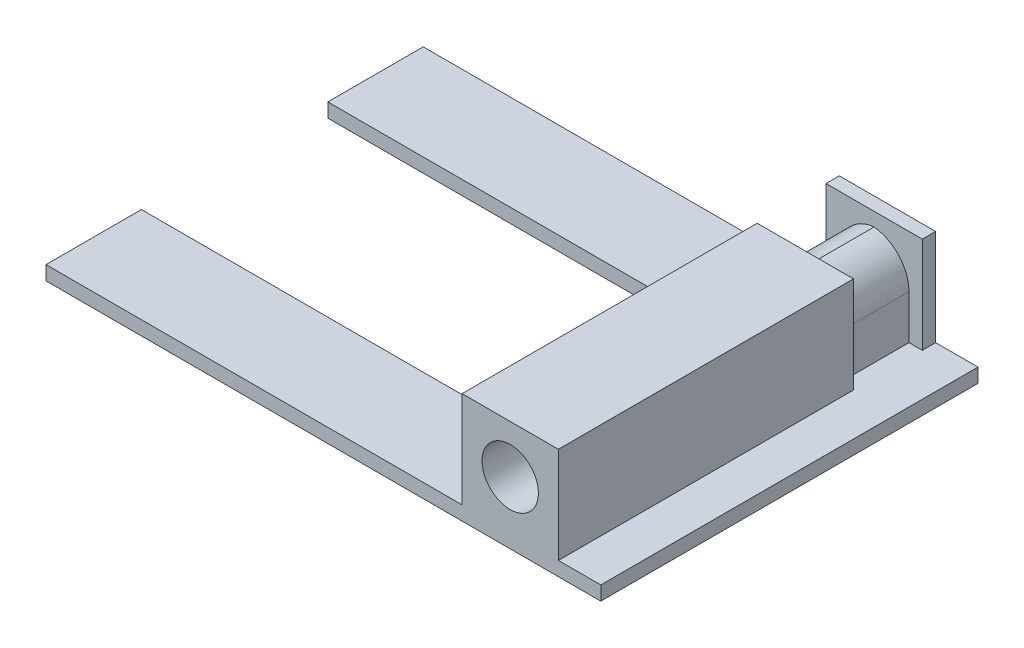
ISO-10303-21;
HEADER;
FILE_DESCRIPTION(('STEP AP214'),'2;1');
FILE_NAME('part.step','',(''),(''),'','','');
FILE_SCHEMA(('AUTOMOTIVE_DESIGN { 1 0 10303 214 1 1 1 1 }'));
ENDSEC;
DATA;
#1=APPLICATION_CONTEXT('core data for automotive mechanical design processes');
#2=APPLICATION_PROTOCOL_DEFINITION('international standard','automotive_design',2000,#1);
#3=PRODUCT_CONTEXT('',#1,'mechanical');
#4=PRODUCT('Part','Part','',(#3));
#5=PRODUCT_RELATED_PRODUCT_CATEGORY('part','',(#4));
#6=PRODUCT_DEFINITION_FORMATION('','',#4);
#7=PRODUCT_DEFINITION_CONTEXT('part definition',#1,'design');
#8=PRODUCT_DEFINITION('design','',#6,#7);
#9=PRODUCT_DEFINITION_SHAPE('','',#8);
#10=(LENGTH_UNIT() NAMED_UNIT(*) SI_UNIT(.MILLI.,.METRE.));
#11=(NAMED_UNIT(*) PLANE_ANGLE_UNIT() SI_UNIT($,.RADIAN.));
#12=(NAMED_UNIT(*) SI_UNIT($,.STERADIAN.) SOLID_ANGLE_UNIT());
#13=UNCERTAINTY_MEASURE_WITH_UNIT(LENGTH_MEASURE(1.E-05),#10,'distance_accuracy_value','');
#14=(GEOMETRIC_REPRESENTATION_CONTEXT(3) GLOBAL_UNCERTAINTY_ASSIGNED_CONTEXT((#13)) GLOBAL_UNIT_ASSIGNED_CONTEXT((#10,
#11,#12)) REPRESENTATION_CONTEXT('',''));
#15=CARTESIAN_POINT('',(0.,0.,0.));
#16=DIRECTION('',(0.,0.,1.));
#17=DIRECTION('',(1.,0.,0.));
#18=AXIS2_PLACEMENT_3D('',#15,#16,#17);
#19=CARTESIAN_POINT('',(94.2504259763748,12.7,-171.211944751792));
#20=DIRECTION('',(1.,0.,0.));
#21=DIRECTION('',(0.,0.,-1.));
#22=AXIS2_PLACEMENT_3D('',#19,#20,#21);
#23=PLANE('',#22);
#24=DIRECTION('',(0.,1.,0.));
#25=VECTOR('',#24,1.);
#26=CARTESIAN_POINT('',(94.2504259763747,87.5000000000001,-159.211944751791));
#27=LINE('',#26,#25);
#28=CARTESIAN_POINT('',(94.2504259763748,12.7,-159.211944751791));
#29=VERTEX_POINT('',#28);
#30=CARTESIAN_POINT('',(94.2504259763747,99.5000000000001,-159.211944751791));
#31=VERTEX_POINT('',#30);
#32=EDGE_CURVE('E238',#29,#31,#27,.T.);
#33=ORIENTED_EDGE('',*,*,#32,.F.);
#34=DIRECTION('',(0.,0.,1.));
#35=VECTOR('',#34,1.);
#36=CARTESIAN_POINT('',(94.2504259763748,12.7,-171.211944751792));
#37=LINE('',#36,#35);
#38=CARTESIAN_POINT('',(94.2504259763748,12.7,-171.211944751792));
#39=VERTEX_POINT('',#38);
#40=EDGE_CURVE('E293',#39,#29,#37,.T.);
#41=ORIENTED_EDGE('',*,*,#40,.F.);
#42=DIRECTION('',(0.,1.,0.));
#43=VECTOR('',#42,1.);
#44=CARTESIAN_POINT('',(94.2504259763748,12.7,-171.211944751792));
#45=LINE('',#44,#43);
#46=CARTESIAN_POINT('',(94.2504259763748,99.5000000000002,-171.211944751792));
#47=VERTEX_POINT('',#46);
#48=EDGE_CURVE('E262',#39,#47,#45,.T.);
#49=ORIENTED_EDGE('',*,*,#48,.T.);
#50=DIRECTION('',(0.,0.,1.));
#51=VECTOR('',#50,1.);
#52=CARTESIAN_POINT('',(94.2504259763748,99.5000000000002,-171.211944751792));
#53=LINE('',#52,#51);
#54=EDGE_CURVE('E288',#47,#31,#53,.T.);
#55=ORIENTED_EDGE('',*,*,#54,.T.);
#56=EDGE_LOOP('',(#33,#41,#49,#55));
#57=FACE_BOUND('',#56,.T.);
#58=ADVANCED_FACE('F39',(#57),#23,.T.);
#59=CARTESIAN_POINT('',(7.45042597637463,12.7,-85.2119447517915));
#60=DIRECTION('',(1.,0.,0.));
#61=DIRECTION('',(0.,0.,-1.));
#62=AXIS2_PLACEMENT_3D('',#59,#60,#61);
#63=PLANE('',#62);
#64=DIRECTION('',(0.,1.,0.));
#65=VECTOR('',#64,1.);
#66=CARTESIAN_POINT('',(7.45042597637467,87.5000000000001,-97.2119447517915));
#67=LINE('',#66,#65);
#68=CARTESIAN_POINT('',(7.45042597637463,12.7,-97.2119447517915));
#69=VERTEX_POINT('',#68);
#70=CARTESIAN_POINT('',(7.45042597637467,99.5000000000001,-97.2119447517915));
#71=VERTEX_POINT('',#70);
#72=EDGE_CURVE('E242',#69,#71,#67,.T.);
#73=ORIENTED_EDGE('',*,*,#72,.F.);
#74=DIRECTION('',(0.,0.,1.));
#75=VECTOR('',#74,1.);
#76=CARTESIAN_POINT('',(7.45042597637468,12.7,-171.211944751792));
#77=LINE('',#76,#75);
#78=CARTESIAN_POINT('',(7.45042597637468,12.7,-85.2119447517915));
#79=VERTEX_POINT('',#78);
#80=EDGE_CURVE('E271',#69,#79,#77,.T.);
#81=ORIENTED_EDGE('',*,*,#80,.T.);
#82=DIRECTION('',(0.,-1.,0.));
#83=VECTOR('',#82,1.);
#84=CARTESIAN_POINT('',(7.45042597637463,12.7,-85.2119447517915));
#85=LINE('',#84,#83);
#86=CARTESIAN_POINT('',(7.45042597637463,0.,-85.2119447517915));
#87=VERTEX_POINT('',#86);
#88=EDGE_CURVE('E331',#79,#87,#85,.T.);
#89=ORIENTED_EDGE('',*,*,#88,.T.);
#90=DIRECTION('',(0.,0.,1.));
#91=VECTOR('',#90,1.);
#92=CARTESIAN_POINT('',(7.45042597637463,0.,-85.2119447517915));
#93=LINE('',#92,#91);
#94=CARTESIAN_POINT('',(7.45042597637466,0.,82.7880552482085));
#95=VERTEX_POINT('',#94);
#96=EDGE_CURVE('E286',#87,#95,#93,.T.);
#97=ORIENTED_EDGE('',*,*,#96,.T.);
#98=DIRECTION('',(0.,-1.,0.));
#99=VECTOR('',#98,1.);
#100=CARTESIAN_POINT('',(7.45042597637466,12.7,82.7880552482085));
#101=LINE('',#100,#99);
#102=CARTESIAN_POINT('',(7.45042597637468,12.7,82.7880552482085));
#103=VERTEX_POINT('',#102);
#104=EDGE_CURVE('E382',#103,#95,#101,.T.);
#105=ORIENTED_EDGE('',*,*,#104,.F.);
#106=CARTESIAN_POINT('',(7.45042597637468,12.7,168.788055248209));
#107=VERTEX_POINT('',#106);
#108=EDGE_CURVE('E301',#103,#107,#77,.T.);
#109=ORIENTED_EDGE('',*,*,#108,.T.);
#110=DIRECTION('',(0.,-1.,0.));
#111=VECTOR('',#110,1.);
#112=CARTESIAN_POINT('',(7.45042597637468,12.7,168.788055248209));
#113=LINE('',#112,#111);
#114=CARTESIAN_POINT('',(7.45042597637468,99.5000000000001,168.788055248209));
#115=VERTEX_POINT('',#114);
#116=EDGE_CURVE('E255',#115,#107,#113,.T.);
#117=ORIENTED_EDGE('',*,*,#116,.F.);
#118=DIRECTION('',(0.,0.,1.));
#119=VECTOR('',#118,1.);
#120=CARTESIAN_POINT('',(7.45042597637468,99.5000000000001,-171.211944751792));
#121=LINE('',#120,#119);
#122=EDGE_CURVE('E287',#71,#115,#121,.T.);
#123=ORIENTED_EDGE('',*,*,#122,.F.);
#124=EDGE_LOOP('',(#73,#81,#89,#97,#105,#109,#117,#123));
#125=FACE_BOUND('',#124,.T.);
#126=ADVANCED_FACE('F407',(#125),#63,.F.);
#127=CARTESIAN_POINT('',(7.45042597637468,99.5000000000001,-171.211944751792));
#128=DIRECTION('',(0.,1.,0.));
#129=DIRECTION('',(-1.,0.,0.));
#130=AXIS2_PLACEMENT_3D('',#127,#128,#129);
#131=PLANE('',#130);
#132=DIRECTION('',(1.,0.,0.));
#133=VECTOR('',#132,1.);
#134=CARTESIAN_POINT('',(7.45042597637467,99.5000000000001,-97.2119447517915));
#135=LINE('',#134,#133);
#136=CARTESIAN_POINT('',(94.2504259763747,99.5000000000001,-97.2119447517915));
#137=VERTEX_POINT('',#136);
#138=EDGE_CURVE('E235',#71,#137,#135,.T.);
#139=ORIENTED_EDGE('',*,*,#138,.F.);
#140=ORIENTED_EDGE('',*,*,#122,.T.);
#141=DIRECTION('',(-1.,0.,0.));
#142=VECTOR('',#141,1.);
#143=CARTESIAN_POINT('',(7.45042597637468,99.5000000000001,168.788055248209));
#144=LINE('',#143,#142);
#145=CARTESIAN_POINT('',(94.2504259763748,99.5000000000002,168.788055248209));
#146=VERTEX_POINT('',#145);
#147=EDGE_CURVE('E263',#146,#115,#144,.T.);
#148=ORIENTED_EDGE('',*,*,#147,.F.);
#149=EDGE_CURVE('E292',#137,#146,#53,.T.);
#150=ORIENTED_EDGE('',*,*,#149,.F.);
#151=EDGE_LOOP('',(#139,#140,#148,#150));
#152=FACE_BOUND('',#151,.T.);
#153=ADVANCED_FACE('F445',(#152),#131,.T.);
#154=CARTESIAN_POINT('',(0.,12.7,0.));
#155=DIRECTION('',(0.,-1.,0.));
#156=DIRECTION('',(0.,0.,-1.));
#157=AXIS2_PLACEMENT_3D('',#154,#155,#156);
#158=PLANE('',#157);
#159=CARTESIAN_POINT('',(7.45042597637468,12.7,-171.211944751792));
#160=VERTEX_POINT('',#159);
#161=CARTESIAN_POINT('',(7.45042597637462,12.7,-159.211944751791));
#162=VERTEX_POINT('',#161);
#163=EDGE_CURVE('E297',#160,#162,#77,.T.);
#164=ORIENTED_EDGE('',*,*,#163,.F.);
#165=DIRECTION('',(1.,0.,0.));
#166=VECTOR('',#165,1.);
#167=CARTESIAN_POINT('',(-367.549574023625,12.7,-171.211944751791));
#168=LINE('',#167,#166);
#169=CARTESIAN_POINT('',(-367.549574023625,12.7,-171.211944751791));
#170=VERTEX_POINT('',#169);
#171=EDGE_CURVE('E320',#170,#160,#168,.T.);
#172=ORIENTED_EDGE('',*,*,#171,.F.);
#173=DIRECTION('',(0.,0.,1.));
#174=VECTOR('',#173,1.);
#175=CARTESIAN_POINT('',(-367.549574023625,12.7,-171.211944751791));
#176=LINE('',#175,#174);
#177=CARTESIAN_POINT('',(-367.549574023625,12.7,-85.2119447517915));
#178=VERTEX_POINT('',#177);
#179=EDGE_CURVE('E324',#170,#178,#176,.T.);
#180=ORIENTED_EDGE('',*,*,#179,.T.);
#181=DIRECTION('',(1.,0.,0.));
#182=VECTOR('',#181,1.);
#183=CARTESIAN_POINT('',(-367.549574023625,12.7,-85.2119447517915));
#184=LINE('',#183,#182);
#185=EDGE_CURVE('E327',#178,#79,#184,.T.);
#186=ORIENTED_EDGE('',*,*,#185,.T.);
#187=ORIENTED_EDGE('',*,*,#80,.F.);
#188=DIRECTION('',(-1.,0.,0.));
#189=VECTOR('',#188,1.);
#190=CARTESIAN_POINT('',(19.4504259763746,12.7,-97.2119447517915));
#191=LINE('',#190,#189);
#192=CARTESIAN_POINT('',(19.4504259763746,12.7,-97.2119447517915));
#193=VERTEX_POINT('',#192);
#194=EDGE_CURVE('E228',#193,#69,#191,.T.);
#195=ORIENTED_EDGE('',*,*,#194,.F.);
#196=DIRECTION('',(0.,0.,1.));
#197=VECTOR('',#196,1.);
#198=CARTESIAN_POINT('',(19.4504259763746,12.7,-159.211944751791));
#199=LINE('',#198,#197);
#200=CARTESIAN_POINT('',(19.4504259763746,12.7,-159.211944751791));
#201=VERTEX_POINT('',#200);
#202=EDGE_CURVE('E217',#201,#193,#199,.T.);
#203=ORIENTED_EDGE('',*,*,#202,.F.);
#204=DIRECTION('',(-1.,0.,0.));
#205=VECTOR('',#204,1.);
#206=CARTESIAN_POINT('',(19.4504259763746,12.7,-159.211944751791));
#207=LINE('',#206,#205);
#208=EDGE_CURVE('E224',#201,#162,#207,.T.);
#209=ORIENTED_EDGE('',*,*,#208,.T.);
#210=EDGE_LOOP('',(#164,#172,#180,#186,#187,#195,#203,#209));
#211=FACE_BOUND('',#210,.T.);
#212=ADVANCED_FACE('F415',(#211),#158,.F.);
#213=ORIENTED_EDGE('',*,*,#108,.F.);
#214=DIRECTION('',(-1.,0.,0.));
#215=VECTOR('',#214,1.);
#216=CARTESIAN_POINT('',(7.45042597637466,12.7,82.7880552482085));
#217=LINE('',#216,#215);
#218=CARTESIAN_POINT('',(-367.549574023625,12.7,82.7880552482085));
#219=VERTEX_POINT('',#218);
#220=EDGE_CURVE('E302',#103,#219,#217,.T.);
#221=ORIENTED_EDGE('',*,*,#220,.T.);
#222=DIRECTION('',(0.,0.,1.));
#223=VECTOR('',#222,1.);
#224=CARTESIAN_POINT('',(-367.549574023625,12.7,82.7880552482085));
#225=LINE('',#224,#223);
#226=CARTESIAN_POINT('',(-367.549574023625,12.7,168.788055248208));
#227=VERTEX_POINT('',#226);
#228=EDGE_CURVE('E305',#219,#227,#225,.T.);
#229=ORIENTED_EDGE('',*,*,#228,.T.);
#230=DIRECTION('',(-1.,0.,0.));
#231=VECTOR('',#230,1.);
#232=CARTESIAN_POINT('',(132.450425976375,12.7,168.788055248209));
#233=LINE('',#232,#231);
#234=EDGE_CURVE('E310',#107,#227,#233,.T.);
#235=ORIENTED_EDGE('',*,*,#234,.F.);
#236=EDGE_LOOP('',(#213,#221,#229,#235));
#237=FACE_BOUND('',#236,.T.);
#238=ADVANCED_FACE('F435',(#237),#158,.F.);
#239=ORIENTED_EDGE('',*,*,#163,.T.);
#240=DIRECTION('',(0.,1.,0.));
#241=VECTOR('',#240,1.);
#242=CARTESIAN_POINT('',(7.45042597637467,87.5000000000001,-159.211944751791));
#243=LINE('',#242,#241);
#244=CARTESIAN_POINT('',(7.45042597637467,99.5000000000001,-159.211944751791));
#245=VERTEX_POINT('',#244);
#246=EDGE_CURVE('E245',#162,#245,#243,.T.);
#247=ORIENTED_EDGE('',*,*,#246,.T.);
#248=CARTESIAN_POINT('',(7.45042597637468,99.5000000000001,-171.211944751792));
#249=VERTEX_POINT('',#248);
#250=EDGE_CURVE('E282',#249,#245,#121,.T.);
#251=ORIENTED_EDGE('',*,*,#250,.F.);
#252=DIRECTION('',(0.,-1.,0.));
#253=VECTOR('',#252,1.);
#254=CARTESIAN_POINT('',(7.45042597637468,12.7,-171.211944751792));
#255=LINE('',#254,#253);
#256=EDGE_CURVE('E259',#249,#160,#255,.T.);
#257=ORIENTED_EDGE('',*,*,#256,.T.);
#258=EDGE_LOOP('',(#239,#247,#251,#257));
#259=FACE_BOUND('',#258,.T.);
#260=ADVANCED_FACE('F485',(#259),#63,.F.);
#261=CARTESIAN_POINT('',(7.45042597637466,12.7,82.7880552482085));
#262=DIRECTION('',(0.,0.,1.));
#263=DIRECTION('',(1.,0.,0.));
#264=AXIS2_PLACEMENT_3D('',#261,#262,#263);
#265=PLANE('',#264);
#266=DIRECTION('',(-1.,0.,0.));
#267=VECTOR('',#266,1.);
#268=CARTESIAN_POINT('',(7.45042597637466,0.,82.7880552482085));
#269=LINE('',#268,#267);
#270=CARTESIAN_POINT('',(-367.549574023625,0.,82.7880552482085));
#271=VERTEX_POINT('',#270);
#272=EDGE_CURVE('E335',#95,#271,#269,.T.);
#273=ORIENTED_EDGE('',*,*,#272,.T.);
#274=DIRECTION('',(0.,-1.,0.));
#275=VECTOR('',#274,1.);
#276=CARTESIAN_POINT('',(-367.549574023625,12.7,82.7880552482085));
#277=LINE('',#276,#275);
#278=EDGE_CURVE('E378',#219,#271,#277,.T.);
#279=ORIENTED_EDGE('',*,*,#278,.F.);
#280=ORIENTED_EDGE('',*,*,#220,.F.);
#281=ORIENTED_EDGE('',*,*,#104,.T.);
#282=EDGE_LOOP('',(#273,#279,#280,#281));
#283=FACE_BOUND('',#282,.T.);
#284=ADVANCED_FACE('F431',(#283),#265,.F.);
#285=CARTESIAN_POINT('',(-367.549574023625,12.7,82.7880552482085));
#286=DIRECTION('',(1.,0.,0.));
#287=DIRECTION('',(0.,0.,-1.));
#288=AXIS2_PLACEMENT_3D('',#285,#286,#287);
#289=PLANE('',#288);
#290=DIRECTION('',(0.,0.,1.));
#291=VECTOR('',#290,1.);
#292=CARTESIAN_POINT('',(-367.549574023625,0.,82.7880552482085));
#293=LINE('',#292,#291);
#294=CARTESIAN_POINT('',(-367.549574023625,0.,168.788055248208));
#295=VERTEX_POINT('',#294);
#296=EDGE_CURVE('E338',#271,#295,#293,.T.);
#297=ORIENTED_EDGE('',*,*,#296,.T.);
#298=DIRECTION('',(0.,-1.,0.));
#299=VECTOR('',#298,1.);
#300=CARTESIAN_POINT('',(-367.549574023625,12.7,168.788055248208));
#301=LINE('',#300,#299);
#302=EDGE_CURVE('E375',#227,#295,#301,.T.);
#303=ORIENTED_EDGE('',*,*,#302,.F.);
#304=ORIENTED_EDGE('',*,*,#228,.F.);
#305=ORIENTED_EDGE('',*,*,#278,.T.);
#306=EDGE_LOOP('',(#297,#303,#304,#305));
#307=FACE_BOUND('',#306,.T.);
#308=ADVANCED_FACE('F527',(#307),#289,.F.);
#309=CARTESIAN_POINT('',(132.450425976375,12.7,168.788055248209));
#310=DIRECTION('',(0.,0.,1.));
#311=DIRECTION('',(1.,0.,0.));
#312=AXIS2_PLACEMENT_3D('',#309,#310,#311);
#313=PLANE('',#312);
#314=DIRECTION('',(-1.,0.,0.));
#315=VECTOR('',#314,1.);
#316=CARTESIAN_POINT('',(132.450425976375,0.,168.788055248209));
#317=LINE('',#316,#315);
#318=CARTESIAN_POINT('',(132.450425976375,0.,168.788055248209));
#319=VERTEX_POINT('',#318);
#320=EDGE_CURVE('E342',#319,#295,#317,.T.);
#321=ORIENTED_EDGE('',*,*,#320,.F.);
#322=DIRECTION('',(0.,-1.,0.));
#323=VECTOR('',#322,1.);
#324=CARTESIAN_POINT('',(132.450425976375,12.7,168.788055248209));
#325=LINE('',#324,#323);
#326=CARTESIAN_POINT('',(132.450425976375,12.7,168.788055248209));
#327=VERTEX_POINT('',#326);
#328=EDGE_CURVE('E372',#327,#319,#325,.T.);
#329=ORIENTED_EDGE('',*,*,#328,.F.);
#330=CARTESIAN_POINT('',(94.2504259763748,12.7,168.788055248209));
#331=VERTEX_POINT('',#330);
#332=EDGE_CURVE('E311',#327,#331,#233,.T.);
#333=ORIENTED_EDGE('',*,*,#332,.T.);
#334=DIRECTION('',(0.,1.,0.));
#335=VECTOR('',#334,1.);
#336=CARTESIAN_POINT('',(94.2504259763748,12.7,168.788055248209));
#337=LINE('',#336,#335);
#338=EDGE_CURVE('E275',#331,#146,#337,.T.);
#339=ORIENTED_EDGE('',*,*,#338,.T.);
#340=ORIENTED_EDGE('',*,*,#147,.T.);
#341=ORIENTED_EDGE('',*,*,#116,.T.);
#342=ORIENTED_EDGE('',*,*,#234,.T.);
#343=ORIENTED_EDGE('',*,*,#302,.T.);
#344=EDGE_LOOP('',(#321,#329,#333,#339,#340,#341,#342,#343));
#345=FACE_BOUND('',#344,.T.);
#346=CARTESIAN_POINT('',(50.8504259763747,56.1000000000001,168.788055248209));
#347=DIRECTION('',(0.,0.,1.));
#348=DIRECTION('',(1.,0.,0.));
#349=AXIS2_PLACEMENT_3D('',#346,#347,#348);
#350=CIRCLE('',#349,25.4);
#351=CARTESIAN_POINT('',(76.2504259763747,56.1000000000001,168.788055248209));
#352=VERTEX_POINT('',#351);
#353=EDGE_CURVE('E241',#352,#352,#350,.T.);
#354=ORIENTED_EDGE('',*,*,#353,.F.);
#355=EDGE_LOOP('',(#354));
#356=FACE_BOUND('',#355,.T.);
#357=ADVANCED_FACE('F440',(#345,#356),#313,.T.);
#358=CARTESIAN_POINT('',(132.450425976375,12.7,-171.211944751792));
#359=DIRECTION('',(1.,0.,0.));
#360=DIRECTION('',(0.,0.,-1.));
#361=AXIS2_PLACEMENT_3D('',#358,#359,#360);
#362=PLANE('',#361);
#363=DIRECTION('',(0.,0.,1.));
#364=VECTOR('',#363,1.);
#365=CARTESIAN_POINT('',(132.450425976375,0.,-171.211944751792));
#366=LINE('',#365,#364);
#367=CARTESIAN_POINT('',(132.450425976375,0.,-171.211944751792));
#368=VERTEX_POINT('',#367);
#369=EDGE_CURVE('E346',#368,#319,#366,.T.);
#370=ORIENTED_EDGE('',*,*,#369,.F.);
#371=DIRECTION('',(0.,-1.,0.));
#372=VECTOR('',#371,1.);
#373=CARTESIAN_POINT('',(132.450425976375,12.7,-171.211944751792));
#374=LINE('',#373,#372);
#375=CARTESIAN_POINT('',(132.450425976375,12.7,-171.211944751792));
#376=VERTEX_POINT('',#375);
#377=EDGE_CURVE('E369',#376,#368,#374,.T.);
#378=ORIENTED_EDGE('',*,*,#377,.F.);
#379=DIRECTION('',(0.,0.,1.));
#380=VECTOR('',#379,1.);
#381=CARTESIAN_POINT('',(132.450425976375,12.7,-171.211944751792));
#382=LINE('',#381,#380);
#383=EDGE_CURVE('E315',#376,#327,#382,.T.);
#384=ORIENTED_EDGE('',*,*,#383,.T.);
#385=ORIENTED_EDGE('',*,*,#328,.T.);
#386=EDGE_LOOP('',(#370,#378,#384,#385));
#387=FACE_BOUND('',#386,.T.);
#388=ADVANCED_FACE('F455',(#387),#362,.T.);
#389=CARTESIAN_POINT('',(-367.549574023625,12.7,-171.211944751791));
#390=DIRECTION('',(0.,0.,-1.));
#391=DIRECTION('',(-1.,0.,0.));
#392=AXIS2_PLACEMENT_3D('',#389,#390,#391);
#393=PLANE('',#392);
#394=DIRECTION('',(1.,0.,0.));
#395=VECTOR('',#394,1.);
#396=CARTESIAN_POINT('',(-367.549574023625,0.,-171.211944751791));
#397=LINE('',#396,#395);
#398=CARTESIAN_POINT('',(-367.549574023625,0.,-171.211944751791));
#399=VERTEX_POINT('',#398);
#400=EDGE_CURVE('E350',#399,#368,#397,.T.);
#401=ORIENTED_EDGE('',*,*,#400,.F.);
#402=DIRECTION('',(0.,-1.,0.));
#403=VECTOR('',#402,1.);
#404=CARTESIAN_POINT('',(-367.549574023625,12.7,-171.211944751791));
#405=LINE('',#404,#403);
#406=EDGE_CURVE('E366',#170,#399,#405,.T.);
#407=ORIENTED_EDGE('',*,*,#406,.F.);
#408=ORIENTED_EDGE('',*,*,#171,.T.);
#409=ORIENTED_EDGE('',*,*,#256,.F.);
#410=DIRECTION('',(-1.,0.,0.));
#411=VECTOR('',#410,1.);
#412=CARTESIAN_POINT('',(7.45042597637468,99.5000000000001,-171.211944751792));
#413=LINE('',#412,#411);
#414=EDGE_CURVE('E267',#47,#249,#413,.T.);
#415=ORIENTED_EDGE('',*,*,#414,.F.);
#416=ORIENTED_EDGE('',*,*,#48,.F.);
#417=EDGE_CURVE('E319',#39,#376,#168,.T.);
#418=ORIENTED_EDGE('',*,*,#417,.T.);
#419=ORIENTED_EDGE('',*,*,#377,.T.);
#420=EDGE_LOOP('',(#401,#407,#408,#409,#415,#416,#418,#419));
#421=FACE_BOUND('',#420,.T.);
#422=CARTESIAN_POINT('',(50.8504259763747,56.1000000000001,-171.211944751792));
#423=DIRECTION('',(0.,0.,1.));
#424=DIRECTION('',(1.,0.,0.));
#425=AXIS2_PLACEMENT_3D('',#422,#423,#424);
#426=CIRCLE('',#425,25.4);
#427=CARTESIAN_POINT('',(76.2504259763747,56.1000000000001,-171.211944751792));
#428=VERTEX_POINT('',#427);
#429=EDGE_CURVE('E251',#428,#428,#426,.T.);
#430=ORIENTED_EDGE('',*,*,#429,.T.);
#431=EDGE_LOOP('',(#430));
#432=FACE_BOUND('',#431,.T.);
#433=ADVANCED_FACE('F457',(#421,#432),#393,.T.);
#434=CARTESIAN_POINT('',(-367.549574023625,12.7,-171.211944751791));
#435=DIRECTION('',(1.,0.,0.));
#436=DIRECTION('',(0.,0.,-1.));
#437=AXIS2_PLACEMENT_3D('',#434,#435,#436);
#438=PLANE('',#437);
#439=DIRECTION('',(0.,0.,1.));
#440=VECTOR('',#439,1.);
#441=CARTESIAN_POINT('',(-367.549574023625,0.,-171.211944751791));
#442=LINE('',#441,#440);
#443=CARTESIAN_POINT('',(-367.549574023625,0.,-85.2119447517915));
#444=VERTEX_POINT('',#443);
#445=EDGE_CURVE('E354',#399,#444,#442,.T.);
#446=ORIENTED_EDGE('',*,*,#445,.T.);
#447=DIRECTION('',(0.,-1.,0.));
#448=VECTOR('',#447,1.);
#449=CARTESIAN_POINT('',(-367.549574023625,12.7,-85.2119447517915));
#450=LINE('',#449,#448);
#451=EDGE_CURVE('E362',#178,#444,#450,.T.);
#452=ORIENTED_EDGE('',*,*,#451,.F.);
#453=ORIENTED_EDGE('',*,*,#179,.F.);
#454=ORIENTED_EDGE('',*,*,#406,.T.);
#455=EDGE_LOOP('',(#446,#452,#453,#454));
#456=FACE_BOUND('',#455,.T.);
#457=ADVANCED_FACE('F513',(#456),#438,.F.);
#458=CARTESIAN_POINT('',(-367.549574023625,12.7,-85.2119447517915));
#459=DIRECTION('',(0.,0.,-1.));
#460=DIRECTION('',(-1.,0.,0.));
#461=AXIS2_PLACEMENT_3D('',#458,#459,#460);
#462=PLANE('',#461);
#463=DIRECTION('',(1.,0.,0.));
#464=VECTOR('',#463,1.);
#465=CARTESIAN_POINT('',(-367.549574023625,0.,-85.2119447517915));
#466=LINE('',#465,#464);
#467=EDGE_CURVE('E306',#444,#87,#466,.T.);
#468=ORIENTED_EDGE('',*,*,#467,.T.);
#469=ORIENTED_EDGE('',*,*,#88,.F.);
#470=ORIENTED_EDGE('',*,*,#185,.F.);
#471=ORIENTED_EDGE('',*,*,#451,.T.);
#472=EDGE_LOOP('',(#468,#469,#470,#471));
#473=FACE_BOUND('',#472,.T.);
#474=ADVANCED_FACE('F420',(#473),#462,.F.);
#475=ORIENTED_EDGE('',*,*,#417,.F.);
#476=ORIENTED_EDGE('',*,*,#40,.T.);
#477=DIRECTION('',(1.,0.,0.));
#478=VECTOR('',#477,1.);
#479=CARTESIAN_POINT('',(82.2504259763748,12.7,-159.211944751791));
#480=LINE('',#479,#478);
#481=CARTESIAN_POINT('',(82.2504259763748,12.7,-159.211944751791));
#482=VERTEX_POINT('',#481);
#483=EDGE_CURVE('E201',#482,#29,#480,.T.);
#484=ORIENTED_EDGE('',*,*,#483,.F.);
#485=DIRECTION('',(0.,0.,-1.));
#486=VECTOR('',#485,1.);
#487=CARTESIAN_POINT('',(82.2504259763748,12.7,-97.2119447517915));
#488=LINE('',#487,#486);
#489=CARTESIAN_POINT('',(82.2504259763748,12.7,-97.2119447517915));
#490=VERTEX_POINT('',#489);
#491=EDGE_CURVE('E187',#490,#482,#488,.T.);
#492=ORIENTED_EDGE('',*,*,#491,.F.);
#493=DIRECTION('',(1.,0.,0.));
#494=VECTOR('',#493,1.);
#495=CARTESIAN_POINT('',(82.2504259763748,12.7,-97.2119447517915));
#496=LINE('',#495,#494);
#497=CARTESIAN_POINT('',(94.2504259763748,12.7,-97.2119447517915));
#498=VERTEX_POINT('',#497);
#499=EDGE_CURVE('E194',#490,#498,#496,.T.);
#500=ORIENTED_EDGE('',*,*,#499,.T.);
#501=EDGE_CURVE('E296',#498,#331,#37,.T.);
#502=ORIENTED_EDGE('',*,*,#501,.T.);
#503=ORIENTED_EDGE('',*,*,#332,.F.);
#504=ORIENTED_EDGE('',*,*,#383,.F.);
#505=EDGE_LOOP('',(#475,#476,#484,#492,#500,#502,#503,#504));
#506=FACE_BOUND('',#505,.T.);
#507=ADVANCED_FACE('F204',(#506),#158,.F.);
#508=CARTESIAN_POINT('',(0.,0.,0.));
#509=DIRECTION('',(0.,-1.,0.));
#510=DIRECTION('',(0.,0.,-1.));
#511=AXIS2_PLACEMENT_3D('',#508,#509,#510);
#512=PLANE('',#511);
#513=ORIENTED_EDGE('',*,*,#96,.F.);
#514=ORIENTED_EDGE('',*,*,#467,.F.);
#515=ORIENTED_EDGE('',*,*,#445,.F.);
#516=ORIENTED_EDGE('',*,*,#400,.T.);
#517=ORIENTED_EDGE('',*,*,#369,.T.);
#518=ORIENTED_EDGE('',*,*,#320,.T.);
#519=ORIENTED_EDGE('',*,*,#296,.F.);
#520=ORIENTED_EDGE('',*,*,#272,.F.);
#521=EDGE_LOOP('',(#513,#514,#515,#516,#517,#518,#519,#520));
#522=FACE_BOUND('',#521,.T.);
#523=ADVANCED_FACE('F424',(#522),#512,.T.);
#524=DIRECTION('',(-1.,0.,0.));
#525=VECTOR('',#524,1.);
#526=CARTESIAN_POINT('',(7.45042597637467,99.5000000000001,-159.211944751791));
#527=LINE('',#526,#525);
#528=EDGE_CURVE('E232',#31,#245,#527,.T.);
#529=ORIENTED_EDGE('',*,*,#528,.F.);
#530=ORIENTED_EDGE('',*,*,#54,.F.);
#531=ORIENTED_EDGE('',*,*,#414,.T.);
#532=ORIENTED_EDGE('',*,*,#250,.T.);
#533=EDGE_LOOP('',(#529,#530,#531,#532));
#534=FACE_BOUND('',#533,.T.);
#535=ADVANCED_FACE('F490',(#534),#131,.T.);
#536=ORIENTED_EDGE('',*,*,#501,.F.);
#537=DIRECTION('',(0.,1.,0.));
#538=VECTOR('',#537,1.);
#539=CARTESIAN_POINT('',(94.2504259763747,87.5000000000001,-97.2119447517915));
#540=LINE('',#539,#538);
#541=EDGE_CURVE('E197',#498,#137,#540,.T.);
#542=ORIENTED_EDGE('',*,*,#541,.T.);
#543=ORIENTED_EDGE('',*,*,#149,.T.);
#544=ORIENTED_EDGE('',*,*,#338,.F.);
#545=EDGE_LOOP('',(#536,#542,#543,#544));
#546=FACE_BOUND('',#545,.T.);
#547=ADVANCED_FACE('F448',(#546),#23,.T.);
#548=CARTESIAN_POINT('',(50.8504259763747,56.1000000000001,-171.211944751792));
#549=DIRECTION('',(0.,0.,1.));
#550=DIRECTION('',(1.,0.,0.));
#551=AXIS2_PLACEMENT_3D('',#548,#549,#550);
#552=CYLINDRICAL_SURFACE('',#551,25.4);
#553=ORIENTED_EDGE('',*,*,#429,.F.);
#554=EDGE_LOOP('',(#553));
#555=FACE_BOUND('',#554,.T.);
#556=ORIENTED_EDGE('',*,*,#353,.T.);
#557=EDGE_LOOP('',(#556));
#558=FACE_BOUND('',#557,.T.);
#559=ADVANCED_FACE('F489',(#555,#558),#552,.F.);
#560=CARTESIAN_POINT('',(7.45042597637467,87.5000000000001,-97.2119447517915));
#561=DIRECTION('',(0.,0.,1.));
#562=DIRECTION('',(1.,0.,0.));
#563=AXIS2_PLACEMENT_3D('',#560,#561,#562);
#564=PLANE('',#563);
#565=ORIENTED_EDGE('',*,*,#138,.T.);
#566=ORIENTED_EDGE('',*,*,#541,.F.);
#567=ORIENTED_EDGE('',*,*,#499,.F.);
#568=DIRECTION('',(0.,-1.,0.));
#569=VECTOR('',#568,1.);
#570=CARTESIAN_POINT('',(82.2504259763748,87.5000000000001,-97.2119447517915));
#571=LINE('',#570,#569);
#572=CARTESIAN_POINT('',(82.2504259763748,52.5000000000001,-97.2119447517915));
#573=VERTEX_POINT('',#572);
#574=EDGE_CURVE('E182',#573,#490,#571,.T.);
#575=ORIENTED_EDGE('',*,*,#574,.F.);
#576=CARTESIAN_POINT('',(47.2504259763748,52.5000000000001,-97.2119447517915));
#577=DIRECTION('',(0.,0.,1.));
#578=DIRECTION('',(1.,0.,0.));
#579=AXIS2_PLACEMENT_3D('',#576,#577,#578);
#580=CIRCLE('',#579,35.);
#581=CARTESIAN_POINT('',(50.8504259763747,87.3143648513083,-97.2119447517915));
#582=VERTEX_POINT('',#581);
#583=EDGE_CURVE('E49',#573,#582,#580,.T.);
#584=ORIENTED_EDGE('',*,*,#583,.T.);
#585=CARTESIAN_POINT('',(54.4504259763746,52.5000000000001,-97.2119447517915));
#586=DIRECTION('',(0.,0.,1.));
#587=DIRECTION('',(1.,0.,0.));
#588=AXIS2_PLACEMENT_3D('',#585,#586,#587);
#589=CIRCLE('',#588,35.);
#590=CARTESIAN_POINT('',(19.4504259763746,52.5000000000001,-97.2119447517915));
#591=VERTEX_POINT('',#590);
#592=EDGE_CURVE('E392',#582,#591,#589,.T.);
#593=ORIENTED_EDGE('',*,*,#592,.T.);
#594=DIRECTION('',(0.,-1.,0.));
#595=VECTOR('',#594,1.);
#596=CARTESIAN_POINT('',(19.4504259763746,87.5000000000001,-97.2119447517915));
#597=LINE('',#596,#595);
#598=EDGE_CURVE('E213',#591,#193,#597,.T.);
#599=ORIENTED_EDGE('',*,*,#598,.T.);
#600=ORIENTED_EDGE('',*,*,#194,.T.);
#601=ORIENTED_EDGE('',*,*,#72,.T.);
#602=EDGE_LOOP('',(#565,#566,#567,#575,#584,#593,#599,#600,#601));
#603=FACE_BOUND('',#602,.T.);
#604=ADVANCED_FACE('F195',(#603),#564,.F.);
#605=CARTESIAN_POINT('',(7.45042597637467,87.5000000000001,-159.211944751791));
#606=DIRECTION('',(0.,0.,-1.));
#607=DIRECTION('',(-1.,0.,0.));
#608=AXIS2_PLACEMENT_3D('',#605,#606,#607);
#609=PLANE('',#608);
#610=ORIENTED_EDGE('',*,*,#528,.T.);
#611=ORIENTED_EDGE('',*,*,#246,.F.);
#612=ORIENTED_EDGE('',*,*,#208,.F.);
#613=DIRECTION('',(0.,-1.,0.));
#614=VECTOR('',#613,1.);
#615=CARTESIAN_POINT('',(19.4504259763746,87.5000000000001,-159.211944751791));
#616=LINE('',#615,#614);
#617=CARTESIAN_POINT('',(19.4504259763746,52.5000000000001,-159.211944751791));
#618=VERTEX_POINT('',#617);
#619=EDGE_CURVE('E221',#618,#201,#616,.T.);
#620=ORIENTED_EDGE('',*,*,#619,.F.);
#621=CARTESIAN_POINT('',(54.4504259763746,52.5000000000001,-159.211944751791));
#622=DIRECTION('',(0.,0.,-1.));
#623=DIRECTION('',(-1.,0.,0.));
#624=AXIS2_PLACEMENT_3D('',#621,#622,#623);
#625=CIRCLE('',#624,35.);
#626=CARTESIAN_POINT('',(50.8504259763747,87.3143648513083,-159.211944751791));
#627=VERTEX_POINT('',#626);
#628=EDGE_CURVE('E55',#618,#627,#625,.T.);
#629=ORIENTED_EDGE('',*,*,#628,.T.);
#630=CARTESIAN_POINT('',(47.2504259763748,52.5000000000001,-159.211944751791));
#631=DIRECTION('',(0.,0.,-1.));
#632=DIRECTION('',(-1.,0.,0.));
#633=AXIS2_PLACEMENT_3D('',#630,#631,#632);
#634=CIRCLE('',#633,35.);
#635=CARTESIAN_POINT('',(82.2504259763748,52.5000000000001,-159.211944751791));
#636=VERTEX_POINT('',#635);
#637=EDGE_CURVE('E11',#627,#636,#634,.T.);
#638=ORIENTED_EDGE('',*,*,#637,.T.);
#639=DIRECTION('',(0.,1.,0.));
#640=VECTOR('',#639,1.);
#641=CARTESIAN_POINT('',(82.2504259763748,87.5000000000001,-159.211944751791));
#642=LINE('',#641,#640);
#643=EDGE_CURVE('E191',#482,#636,#642,.T.);
#644=ORIENTED_EDGE('',*,*,#643,.F.);
#645=ORIENTED_EDGE('',*,*,#483,.T.);
#646=ORIENTED_EDGE('',*,*,#32,.T.);
#647=EDGE_LOOP('',(#610,#611,#612,#620,#629,#638,#644,#645,#646));
#648=FACE_BOUND('',#647,.T.);
#649=ADVANCED_FACE('F463',(#648),#609,.F.);
#650=CARTESIAN_POINT('',(19.4504259763746,0.,0.));
#651=DIRECTION('',(1.,0.,0.));
#652=DIRECTION('',(0.,0.,-1.));
#653=AXIS2_PLACEMENT_3D('',#650,#651,#652);
#654=PLANE('',#653);
#655=ORIENTED_EDGE('',*,*,#598,.F.);
#656=DIRECTION('',(0.,0.,1.));
#657=VECTOR('',#656,1.);
#658=CARTESIAN_POINT('',(19.4504259763746,52.5000000000001,-159.211944751791));
#659=LINE('',#658,#657);
#660=EDGE_CURVE('E386',#591,#618,#659,.F.);
#661=ORIENTED_EDGE('',*,*,#660,.T.);
#662=ORIENTED_EDGE('',*,*,#619,.T.);
#663=ORIENTED_EDGE('',*,*,#202,.T.);
#664=EDGE_LOOP('',(#655,#661,#662,#663));
#665=FACE_BOUND('',#664,.T.);
#666=ADVANCED_FACE('F477',(#665),#654,.F.);
#667=CARTESIAN_POINT('',(82.2504259763748,0.,0.));
#668=DIRECTION('',(1.,0.,0.));
#669=DIRECTION('',(0.,0.,-1.));
#670=AXIS2_PLACEMENT_3D('',#667,#668,#669);
#671=PLANE('',#670);
#672=ORIENTED_EDGE('',*,*,#643,.T.);
#673=DIRECTION('',(0.,0.,1.));
#674=VECTOR('',#673,1.);
#675=CARTESIAN_POINT('',(82.2504259763748,52.5000000000001,0.));
#676=LINE('',#675,#674);
#677=EDGE_CURVE('E189',#636,#573,#676,.T.);
#678=ORIENTED_EDGE('',*,*,#677,.T.);
#679=ORIENTED_EDGE('',*,*,#574,.T.);
#680=ORIENTED_EDGE('',*,*,#491,.T.);
#681=EDGE_LOOP('',(#672,#678,#679,#680));
#682=FACE_BOUND('',#681,.T.);
#683=ADVANCED_FACE('F185',(#682),#671,.T.);
#684=CARTESIAN_POINT('',(47.2504259763748,52.5000000000001,0.));
#685=DIRECTION('',(0.,0.,1.));
#686=DIRECTION('',(1.,0.,0.));
#687=AXIS2_PLACEMENT_3D('',#684,#685,#686);
#688=CYLINDRICAL_SURFACE('',#687,35.);
#689=ORIENTED_EDGE('',*,*,#677,.F.);
#690=ORIENTED_EDGE('',*,*,#637,.F.);
#691=DIRECTION('',(0.,0.,1.));
#692=VECTOR('',#691,1.);
#693=CARTESIAN_POINT('',(50.8504259763747,87.3143648513083,-128.211944751791));
#694=LINE('',#693,#692);
#695=EDGE_CURVE('E43',#582,#627,#694,.F.);
#696=ORIENTED_EDGE('',*,*,#695,.F.);
#697=ORIENTED_EDGE('',*,*,#583,.F.);
#698=EDGE_LOOP('',(#689,#690,#696,#697));
#699=FACE_BOUND('',#698,.T.);
#700=ADVANCED_FACE('F41',(#699),#688,.T.);
#701=CARTESIAN_POINT('',(54.4504259763746,52.5000000000001,0.));
#702=DIRECTION('',(0.,0.,-1.));
#703=DIRECTION('',(-1.,0.,0.));
#704=AXIS2_PLACEMENT_3D('',#701,#702,#703);
#705=CYLINDRICAL_SURFACE('',#704,35.);
#706=ORIENTED_EDGE('',*,*,#628,.F.);
#707=ORIENTED_EDGE('',*,*,#660,.F.);
#708=ORIENTED_EDGE('',*,*,#592,.F.);
#709=ORIENTED_EDGE('',*,*,#695,.T.);
#710=EDGE_LOOP('',(#706,#707,#708,#709));
#711=FACE_BOUND('',#710,.T.);
#712=ADVANCED_FACE('F469',(#711),#705,.T.);
#713=CLOSED_SHELL('',(#58,#126,#153,#212,#238,#260,#284,#308,#357,#388,#433,#457,#474,#507,#523,
#535,#547,#559,#604,#649,#666,#683,#700,#712));
#714=MANIFOLD_SOLID_BREP('B2',#713);
#715=ADVANCED_BREP_SHAPE_REPRESENTATION('',(#18,#714),#14);
#716=SHAPE_DEFINITION_REPRESENTATION(#9,#715);
ENDSEC;
END-ISO-10303-21;
